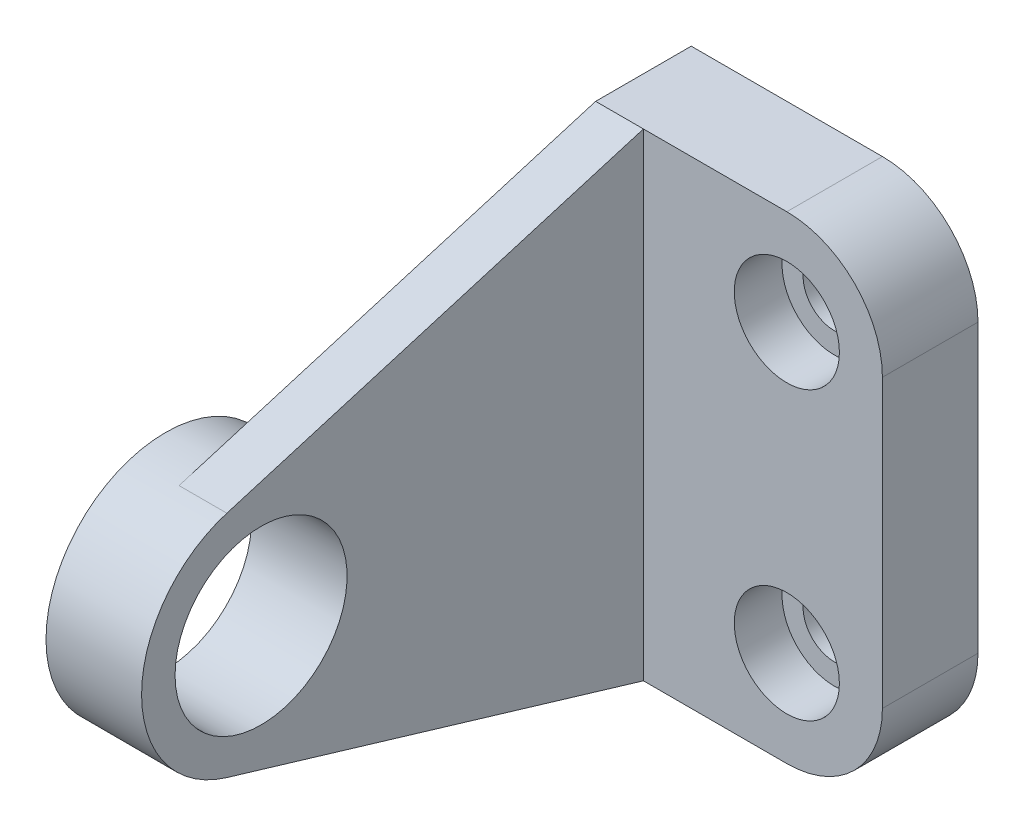
ISO-10303-21;
HEADER;
FILE_DESCRIPTION(('STEP AP214'),'2;1');
FILE_NAME('part.step','',(''),(''),'','','');
FILE_SCHEMA(('AUTOMOTIVE_DESIGN { 1 0 10303 214 1 1 1 1 }'));
ENDSEC;
DATA;
#1=APPLICATION_CONTEXT('core data for automotive mechanical design processes');
#2=APPLICATION_PROTOCOL_DEFINITION('international standard','automotive_design',2000,#1);
#3=PRODUCT_CONTEXT('',#1,'mechanical');
#4=PRODUCT('Part','Part','',(#3));
#5=PRODUCT_RELATED_PRODUCT_CATEGORY('part','',(#4));
#6=PRODUCT_DEFINITION_FORMATION('','',#4);
#7=PRODUCT_DEFINITION_CONTEXT('part definition',#1,'design');
#8=PRODUCT_DEFINITION('design','',#6,#7);
#9=PRODUCT_DEFINITION_SHAPE('','',#8);
#10=(LENGTH_UNIT() NAMED_UNIT(*) SI_UNIT(.MILLI.,.METRE.));
#11=(NAMED_UNIT(*) PLANE_ANGLE_UNIT() SI_UNIT($,.RADIAN.));
#12=(NAMED_UNIT(*) SI_UNIT($,.STERADIAN.) SOLID_ANGLE_UNIT());
#13=UNCERTAINTY_MEASURE_WITH_UNIT(LENGTH_MEASURE(1.E-05),#10,'distance_accuracy_value','');
#14=(GEOMETRIC_REPRESENTATION_CONTEXT(3) GLOBAL_UNCERTAINTY_ASSIGNED_CONTEXT((#13)) GLOBAL_UNIT_ASSIGNED_CONTEXT((#10,
#11,#12)) REPRESENTATION_CONTEXT('',''));
#15=CARTESIAN_POINT('',(0.,0.,0.));
#16=DIRECTION('',(0.,0.,1.));
#17=DIRECTION('',(1.,0.,0.));
#18=AXIS2_PLACEMENT_3D('',#15,#16,#17);
#19=CARTESIAN_POINT('',(15.,25.,10.));
#20=DIRECTION('',(-1.,0.,0.));
#21=DIRECTION('',(0.,0.,1.));
#22=AXIS2_PLACEMENT_3D('',#19,#20,#21);
#23=PLANE('',#22);
#24=DIRECTION('',(0.,1.,0.));
#25=VECTOR('',#24,1.);
#26=CARTESIAN_POINT('',(15.,25.,0.));
#27=LINE('',#26,#25);
#28=CARTESIAN_POINT('',(15.,-15.,0.));
#29=VERTEX_POINT('',#28);
#30=CARTESIAN_POINT('',(15.,15.,0.));
#31=VERTEX_POINT('',#30);
#32=EDGE_CURVE('E159',#29,#31,#27,.T.);
#33=ORIENTED_EDGE('',*,*,#32,.T.);
#34=DIRECTION('',(0.,0.,-1.));
#35=VECTOR('',#34,1.);
#36=CARTESIAN_POINT('',(15.,15.,10.));
#37=LINE('',#36,#35);
#38=CARTESIAN_POINT('',(15.,15.,10.));
#39=VERTEX_POINT('',#38);
#40=EDGE_CURVE('E63',#31,#39,#37,.F.);
#41=ORIENTED_EDGE('',*,*,#40,.T.);
#42=DIRECTION('',(0.,1.,0.));
#43=VECTOR('',#42,1.);
#44=CARTESIAN_POINT('',(15.,25.,10.));
#45=LINE('',#44,#43);
#46=CARTESIAN_POINT('',(15.,-15.,10.));
#47=VERTEX_POINT('',#46);
#48=EDGE_CURVE('E149',#47,#39,#45,.T.);
#49=ORIENTED_EDGE('',*,*,#48,.F.);
#50=DIRECTION('',(0.,0.,-1.));
#51=VECTOR('',#50,1.);
#52=CARTESIAN_POINT('',(15.,-15.,10.));
#53=LINE('',#52,#51);
#54=EDGE_CURVE('E178',#47,#29,#53,.T.);
#55=ORIENTED_EDGE('',*,*,#54,.T.);
#56=EDGE_LOOP('',(#33,#41,#49,#55));
#57=FACE_BOUND('',#56,.T.);
#58=ADVANCED_FACE('F42',(#57),#23,.F.);
#59=CARTESIAN_POINT('',(-15.,25.,10.));
#60=DIRECTION('',(0.,-1.,0.));
#61=DIRECTION('',(0.,0.,-1.));
#62=AXIS2_PLACEMENT_3D('',#59,#60,#61);
#63=PLANE('',#62);
#64=DIRECTION('',(-1.,0.,0.));
#65=VECTOR('',#64,1.);
#66=CARTESIAN_POINT('',(-15.,25.,10.));
#67=LINE('',#66,#65);
#68=CARTESIAN_POINT('',(5.,25.,10.));
#69=VERTEX_POINT('',#68);
#70=CARTESIAN_POINT('',(-10.,25.,10.));
#71=VERTEX_POINT('',#70);
#72=EDGE_CURVE('E151',#69,#71,#67,.T.);
#73=ORIENTED_EDGE('',*,*,#72,.F.);
#74=DIRECTION('',(0.,0.,-1.));
#75=VECTOR('',#74,1.);
#76=CARTESIAN_POINT('',(5.,25.,10.));
#77=LINE('',#76,#75);
#78=CARTESIAN_POINT('',(5.,25.,0.));
#79=VERTEX_POINT('',#78);
#80=EDGE_CURVE('E171',#69,#79,#77,.T.);
#81=ORIENTED_EDGE('',*,*,#80,.T.);
#82=DIRECTION('',(-1.,0.,0.));
#83=VECTOR('',#82,1.);
#84=CARTESIAN_POINT('',(-15.,25.,0.));
#85=LINE('',#84,#83);
#86=CARTESIAN_POINT('',(-15.,25.,0.));
#87=VERTEX_POINT('',#86);
#88=EDGE_CURVE('E161',#79,#87,#85,.T.);
#89=ORIENTED_EDGE('',*,*,#88,.T.);
#90=DIRECTION('',(0.,0.,-1.));
#91=VECTOR('',#90,1.);
#92=CARTESIAN_POINT('',(-15.,25.,10.));
#93=LINE('',#92,#91);
#94=CARTESIAN_POINT('',(-15.,25.,10.));
#95=VERTEX_POINT('',#94);
#96=EDGE_CURVE('E168',#95,#87,#93,.T.);
#97=ORIENTED_EDGE('',*,*,#96,.F.);
#98=DIRECTION('',(-1.,0.,0.));
#99=VECTOR('',#98,1.);
#100=CARTESIAN_POINT('',(-10.,25.,10.));
#101=LINE('',#100,#99);
#102=EDGE_CURVE('E142',#71,#95,#101,.T.);
#103=ORIENTED_EDGE('',*,*,#102,.F.);
#104=EDGE_LOOP('',(#73,#81,#89,#97,#103));
#105=FACE_BOUND('',#104,.T.);
#106=ADVANCED_FACE('F191',(#105),#63,.F.);
#107=CARTESIAN_POINT('',(-15.,25.,10.));
#108=DIRECTION('',(1.,0.,0.));
#109=DIRECTION('',(0.,0.,-1.));
#110=AXIS2_PLACEMENT_3D('',#107,#108,#109);
#111=PLANE('',#110);
#112=DIRECTION('',(0.,-1.,0.));
#113=VECTOR('',#112,1.);
#114=CARTESIAN_POINT('',(-15.,25.,0.));
#115=LINE('',#114,#113);
#116=CARTESIAN_POINT('',(-15.,-25.,0.));
#117=VERTEX_POINT('',#116);
#118=EDGE_CURVE('E163',#87,#117,#115,.T.);
#119=ORIENTED_EDGE('',*,*,#118,.T.);
#120=DIRECTION('',(0.,0.,-1.));
#121=VECTOR('',#120,1.);
#122=CARTESIAN_POINT('',(-15.,-25.,10.));
#123=LINE('',#122,#121);
#124=CARTESIAN_POINT('',(-15.,-25.,10.));
#125=VERTEX_POINT('',#124);
#126=EDGE_CURVE('E158',#125,#117,#123,.T.);
#127=ORIENTED_EDGE('',*,*,#126,.F.);
#128=DIRECTION('',(0.,0.286331612321917,0.958130579715068));
#129=VECTOR('',#128,1.);
#130=CARTESIAN_POINT('',(-15.,-25.6937859316758,7.6784347647674));
#131=LINE('',#130,#129);
#132=CARTESIAN_POINT('',(-15.,-11.9766322464384,53.579145154024));
#133=VERTEX_POINT('',#132);
#134=EDGE_CURVE('E136',#125,#133,#131,.T.);
#135=ORIENTED_EDGE('',*,*,#134,.T.);
#136=CARTESIAN_POINT('',(-15.,0.,50.));
#137=DIRECTION('',(-1.,0.,0.));
#138=DIRECTION('',(0.,0.,1.));
#139=AXIS2_PLACEMENT_3D('',#136,#137,#138);
#140=CIRCLE('',#139,12.5);
#141=CARTESIAN_POINT('',(-15.,11.9766322464383,53.579145154024));
#142=VERTEX_POINT('',#141);
#143=EDGE_CURVE('E125',#142,#133,#140,.T.);
#144=ORIENTED_EDGE('',*,*,#143,.F.);
#145=DIRECTION('',(0.,-0.286331612321917,0.958130579715068));
#146=VECTOR('',#145,1.);
#147=CARTESIAN_POINT('',(-15.,25.6937859316758,7.6784347647674));
#148=LINE('',#147,#146);
#149=EDGE_CURVE('E140',#95,#142,#148,.T.);
#150=ORIENTED_EDGE('',*,*,#149,.F.);
#151=ORIENTED_EDGE('',*,*,#96,.T.);
#152=EDGE_LOOP('',(#119,#127,#135,#144,#150,#151));
#153=FACE_BOUND('',#152,.T.);
#154=ADVANCED_FACE('F207',(#153),#111,.F.);
#155=CARTESIAN_POINT('',(-15.,-25.,10.));
#156=DIRECTION('',(0.,1.,0.));
#157=DIRECTION('',(0.,0.,1.));
#158=AXIS2_PLACEMENT_3D('',#155,#156,#157);
#159=PLANE('',#158);
#160=DIRECTION('',(1.,0.,0.));
#161=VECTOR('',#160,1.);
#162=CARTESIAN_POINT('',(-15.,-25.,0.));
#163=LINE('',#162,#161);
#164=CARTESIAN_POINT('',(5.,-25.,0.));
#165=VERTEX_POINT('',#164);
#166=EDGE_CURVE('E152',#117,#165,#163,.T.);
#167=ORIENTED_EDGE('',*,*,#166,.T.);
#168=DIRECTION('',(0.,0.,-1.));
#169=VECTOR('',#168,1.);
#170=CARTESIAN_POINT('',(5.,-25.,10.));
#171=LINE('',#170,#169);
#172=CARTESIAN_POINT('',(5.,-25.,10.));
#173=VERTEX_POINT('',#172);
#174=EDGE_CURVE('E11',#165,#173,#171,.F.);
#175=ORIENTED_EDGE('',*,*,#174,.T.);
#176=DIRECTION('',(1.,0.,0.));
#177=VECTOR('',#176,1.);
#178=CARTESIAN_POINT('',(-15.,-25.,10.));
#179=LINE('',#178,#177);
#180=CARTESIAN_POINT('',(-10.,-25.,10.));
#181=VERTEX_POINT('',#180);
#182=EDGE_CURVE('E154',#181,#173,#179,.T.);
#183=ORIENTED_EDGE('',*,*,#182,.F.);
#184=EDGE_CURVE('E155',#125,#181,#179,.T.);
#185=ORIENTED_EDGE('',*,*,#184,.F.);
#186=ORIENTED_EDGE('',*,*,#126,.T.);
#187=EDGE_LOOP('',(#167,#175,#183,#185,#186));
#188=FACE_BOUND('',#187,.T.);
#189=ADVANCED_FACE('F202',(#188),#159,.F.);
#190=CARTESIAN_POINT('',(0.,0.,10.));
#191=DIRECTION('',(0.,0.,1.));
#192=DIRECTION('',(1.,0.,0.));
#193=AXIS2_PLACEMENT_3D('',#190,#191,#192);
#194=PLANE('',#193);
#195=CARTESIAN_POINT('',(5.,-15.,10.));
#196=DIRECTION('',(0.,0.,1.));
#197=DIRECTION('',(1.,0.,0.));
#198=AXIS2_PLACEMENT_3D('',#195,#196,#197);
#199=CIRCLE('',#198,5.49999999999999);
#200=CARTESIAN_POINT('',(10.5,-15.,10.));
#201=VERTEX_POINT('',#200);
#202=EDGE_CURVE('E357',#201,#201,#199,.T.);
#203=ORIENTED_EDGE('',*,*,#202,.F.);
#204=EDGE_LOOP('',(#203));
#205=FACE_BOUND('',#204,.T.);
#206=CARTESIAN_POINT('',(5.,15.,10.));
#207=DIRECTION('',(0.,0.,1.));
#208=DIRECTION('',(1.,0.,0.));
#209=AXIS2_PLACEMENT_3D('',#206,#207,#208);
#210=CIRCLE('',#209,5.49999999999999);
#211=CARTESIAN_POINT('',(10.5,15.,10.));
#212=VERTEX_POINT('',#211);
#213=EDGE_CURVE('E367',#212,#212,#210,.T.);
#214=ORIENTED_EDGE('',*,*,#213,.F.);
#215=EDGE_LOOP('',(#214));
#216=FACE_BOUND('',#215,.T.);
#217=ORIENTED_EDGE('',*,*,#48,.T.);
#218=CARTESIAN_POINT('',(5.,15.,10.));
#219=DIRECTION('',(0.,0.,1.));
#220=DIRECTION('',(1.,0.,0.));
#221=AXIS2_PLACEMENT_3D('',#218,#219,#220);
#222=CIRCLE('',#221,10.);
#223=EDGE_CURVE('E50',#39,#69,#222,.T.);
#224=ORIENTED_EDGE('',*,*,#223,.T.);
#225=ORIENTED_EDGE('',*,*,#72,.T.);
#226=DIRECTION('',(0.,1.,0.));
#227=VECTOR('',#226,1.);
#228=CARTESIAN_POINT('',(-10.,0.,10.));
#229=LINE('',#228,#227);
#230=EDGE_CURVE('E133',#181,#71,#229,.T.);
#231=ORIENTED_EDGE('',*,*,#230,.F.);
#232=ORIENTED_EDGE('',*,*,#182,.T.);
#233=CARTESIAN_POINT('',(5.,-15.,10.));
#234=DIRECTION('',(0.,0.,1.));
#235=DIRECTION('',(1.,0.,0.));
#236=AXIS2_PLACEMENT_3D('',#233,#234,#235);
#237=CIRCLE('',#236,10.);
#238=EDGE_CURVE('E182',#173,#47,#237,.T.);
#239=ORIENTED_EDGE('',*,*,#238,.T.);
#240=EDGE_LOOP('',(#217,#224,#225,#231,#232,#239));
#241=FACE_BOUND('',#240,.T.);
#242=ADVANCED_FACE('F186',(#205,#216,#241),#194,.T.);
#243=CARTESIAN_POINT('',(0.,0.,0.));
#244=DIRECTION('',(0.,0.,1.));
#245=DIRECTION('',(1.,0.,0.));
#246=AXIS2_PLACEMENT_3D('',#243,#244,#245);
#247=PLANE('',#246);
#248=CARTESIAN_POINT('',(5.,-15.,0.));
#249=DIRECTION('',(0.,0.,1.));
#250=DIRECTION('',(1.,0.,0.));
#251=AXIS2_PLACEMENT_3D('',#248,#249,#250);
#252=CIRCLE('',#251,3.3);
#253=CARTESIAN_POINT('',(8.3,-15.,0.));
#254=VERTEX_POINT('',#253);
#255=EDGE_CURVE('E364',#254,#254,#252,.T.);
#256=ORIENTED_EDGE('',*,*,#255,.T.);
#257=EDGE_LOOP('',(#256));
#258=FACE_BOUND('',#257,.T.);
#259=CARTESIAN_POINT('',(5.,15.,0.));
#260=DIRECTION('',(0.,0.,1.));
#261=DIRECTION('',(1.,0.,0.));
#262=AXIS2_PLACEMENT_3D('',#259,#260,#261);
#263=CIRCLE('',#262,3.3);
#264=CARTESIAN_POINT('',(8.3,15.,0.));
#265=VERTEX_POINT('',#264);
#266=EDGE_CURVE('E376',#265,#265,#263,.T.);
#267=ORIENTED_EDGE('',*,*,#266,.T.);
#268=EDGE_LOOP('',(#267));
#269=FACE_BOUND('',#268,.T.);
#270=ORIENTED_EDGE('',*,*,#88,.F.);
#271=CARTESIAN_POINT('',(5.,15.,0.));
#272=DIRECTION('',(0.,0.,1.));
#273=DIRECTION('',(1.,0.,0.));
#274=AXIS2_PLACEMENT_3D('',#271,#272,#273);
#275=CIRCLE('',#274,10.);
#276=EDGE_CURVE('E176',#79,#31,#275,.F.);
#277=ORIENTED_EDGE('',*,*,#276,.T.);
#278=ORIENTED_EDGE('',*,*,#32,.F.);
#279=CARTESIAN_POINT('',(5.,-15.,0.));
#280=DIRECTION('',(0.,0.,1.));
#281=DIRECTION('',(1.,0.,0.));
#282=AXIS2_PLACEMENT_3D('',#279,#280,#281);
#283=CIRCLE('',#282,10.);
#284=EDGE_CURVE('E174',#29,#165,#283,.F.);
#285=ORIENTED_EDGE('',*,*,#284,.T.);
#286=ORIENTED_EDGE('',*,*,#166,.F.);
#287=ORIENTED_EDGE('',*,*,#118,.F.);
#288=EDGE_LOOP('',(#270,#277,#278,#285,#286,#287));
#289=FACE_BOUND('',#288,.T.);
#290=ADVANCED_FACE('F196',(#258,#269,#289),#247,.F.);
#291=CARTESIAN_POINT('',(-10.,-25.6937859316758,7.6784347647674));
#292=DIRECTION('',(0.,-0.958130579715068,0.286331612321917));
#293=DIRECTION('',(0.,-0.286331612321917,-0.958130579715068));
#294=AXIS2_PLACEMENT_3D('',#291,#292,#293);
#295=PLANE('',#294);
#296=ORIENTED_EDGE('',*,*,#134,.F.);
#297=ORIENTED_EDGE('',*,*,#184,.T.);
#298=DIRECTION('',(0.,0.286331612321917,0.958130579715068));
#299=VECTOR('',#298,1.);
#300=CARTESIAN_POINT('',(-10.,-25.6937859316758,7.6784347647674));
#301=LINE('',#300,#299);
#302=CARTESIAN_POINT('',(-10.,-11.9766322464383,53.579145154024));
#303=VERTEX_POINT('',#302);
#304=EDGE_CURVE('E143',#181,#303,#301,.T.);
#305=ORIENTED_EDGE('',*,*,#304,.T.);
#306=DIRECTION('',(-1.,0.,0.));
#307=VECTOR('',#306,1.);
#308=CARTESIAN_POINT('',(-10.,-11.9766322464383,53.579145154024));
#309=LINE('',#308,#307);
#310=EDGE_CURVE('E121',#303,#133,#309,.T.);
#311=ORIENTED_EDGE('',*,*,#310,.T.);
#312=EDGE_LOOP('',(#296,#297,#305,#311));
#313=FACE_BOUND('',#312,.T.);
#314=ADVANCED_FACE('F212',(#313),#295,.T.);
#315=CARTESIAN_POINT('',(-10.,25.6937859316758,7.6784347647674));
#316=DIRECTION('',(0.,-0.958130579715068,-0.286331612321917));
#317=DIRECTION('',(0.,0.286331612321917,-0.958130579715068));
#318=AXIS2_PLACEMENT_3D('',#315,#316,#317);
#319=PLANE('',#318);
#320=ORIENTED_EDGE('',*,*,#149,.T.);
#321=DIRECTION('',(-1.,0.,0.));
#322=VECTOR('',#321,1.);
#323=CARTESIAN_POINT('',(-10.,11.9766322464383,53.579145154024));
#324=LINE('',#323,#322);
#325=CARTESIAN_POINT('',(-10.,11.9766322464383,53.579145154024));
#326=VERTEX_POINT('',#325);
#327=EDGE_CURVE('E118',#326,#142,#324,.T.);
#328=ORIENTED_EDGE('',*,*,#327,.F.);
#329=DIRECTION('',(0.,-0.286331612321917,0.958130579715068));
#330=VECTOR('',#329,1.);
#331=CARTESIAN_POINT('',(-10.,25.6937859316758,7.6784347647674));
#332=LINE('',#331,#330);
#333=EDGE_CURVE('E130',#71,#326,#332,.T.);
#334=ORIENTED_EDGE('',*,*,#333,.F.);
#335=ORIENTED_EDGE('',*,*,#102,.T.);
#336=EDGE_LOOP('',(#320,#328,#334,#335));
#337=FACE_BOUND('',#336,.T.);
#338=ADVANCED_FACE('F138',(#337),#319,.F.);
#339=CARTESIAN_POINT('',(-10.,0.,0.));
#340=DIRECTION('',(-1.,0.,0.));
#341=DIRECTION('',(0.,0.,1.));
#342=AXIS2_PLACEMENT_3D('',#339,#340,#341);
#343=PLANE('',#342);
#344=ORIENTED_EDGE('',*,*,#333,.T.);
#345=CARTESIAN_POINT('',(-10.,0.,50.));
#346=DIRECTION('',(-1.,0.,0.));
#347=DIRECTION('',(0.,0.,1.));
#348=AXIS2_PLACEMENT_3D('',#345,#346,#347);
#349=CIRCLE('',#348,12.5);
#350=EDGE_CURVE('E114',#303,#326,#349,.T.);
#351=ORIENTED_EDGE('',*,*,#350,.F.);
#352=ORIENTED_EDGE('',*,*,#304,.F.);
#353=ORIENTED_EDGE('',*,*,#230,.T.);
#354=EDGE_LOOP('',(#344,#351,#352,#353));
#355=FACE_BOUND('',#354,.T.);
#356=CARTESIAN_POINT('',(-10.,0.,50.));
#357=DIRECTION('',(-1.,0.,0.));
#358=DIRECTION('',(0.,0.,1.));
#359=AXIS2_PLACEMENT_3D('',#356,#357,#358);
#360=CIRCLE('',#359,9.);
#361=CARTESIAN_POINT('',(-10.,0.,59.));
#362=VERTEX_POINT('',#361);
#363=EDGE_CURVE('E126',#362,#362,#360,.T.);
#364=ORIENTED_EDGE('',*,*,#363,.T.);
#365=EDGE_LOOP('',(#364));
#366=FACE_BOUND('',#365,.T.);
#367=ADVANCED_FACE('F131',(#355,#366),#343,.F.);
#368=CARTESIAN_POINT('',(-10.,0.,50.));
#369=DIRECTION('',(-1.,0.,0.));
#370=DIRECTION('',(0.,0.,1.));
#371=AXIS2_PLACEMENT_3D('',#368,#369,#370);
#372=CYLINDRICAL_SURFACE('',#371,12.5);
#373=CARTESIAN_POINT('',(-20.,0.,50.));
#374=DIRECTION('',(-1.,0.,0.));
#375=DIRECTION('',(0.,0.,1.));
#376=AXIS2_PLACEMENT_3D('',#373,#374,#375);
#377=CIRCLE('',#376,12.5);
#378=CARTESIAN_POINT('',(-20.,0.,62.5));
#379=VERTEX_POINT('',#378);
#380=EDGE_CURVE('E382',#379,#379,#377,.T.);
#381=ORIENTED_EDGE('',*,*,#380,.F.);
#382=EDGE_LOOP('',(#381));
#383=FACE_BOUND('',#382,.T.);
#384=ORIENTED_EDGE('',*,*,#310,.F.);
#385=ORIENTED_EDGE('',*,*,#350,.T.);
#386=ORIENTED_EDGE('',*,*,#327,.T.);
#387=ORIENTED_EDGE('',*,*,#143,.T.);
#388=EDGE_LOOP('',(#384,#385,#386,#387));
#389=FACE_BOUND('',#388,.T.);
#390=ADVANCED_FACE('F116',(#383,#389),#372,.T.);
#391=CARTESIAN_POINT('',(-10.,0.,50.));
#392=DIRECTION('',(-1.,0.,0.));
#393=DIRECTION('',(0.,0.,1.));
#394=AXIS2_PLACEMENT_3D('',#391,#392,#393);
#395=CYLINDRICAL_SURFACE('',#394,9.);
#396=ORIENTED_EDGE('',*,*,#363,.F.);
#397=EDGE_LOOP('',(#396));
#398=FACE_BOUND('',#397,.T.);
#399=CARTESIAN_POINT('',(-20.,0.,50.));
#400=DIRECTION('',(-1.,0.,0.));
#401=DIRECTION('',(0.,0.,1.));
#402=AXIS2_PLACEMENT_3D('',#399,#400,#401);
#403=CIRCLE('',#402,9.);
#404=CARTESIAN_POINT('',(-20.,0.,59.));
#405=VERTEX_POINT('',#404);
#406=EDGE_CURVE('E379',#405,#405,#403,.T.);
#407=ORIENTED_EDGE('',*,*,#406,.T.);
#408=EDGE_LOOP('',(#407));
#409=FACE_BOUND('',#408,.T.);
#410=ADVANCED_FACE('F237',(#398,#409),#395,.F.);
#411=CARTESIAN_POINT('',(-20.,0.,0.));
#412=DIRECTION('',(-1.,0.,0.));
#413=DIRECTION('',(0.,0.,1.));
#414=AXIS2_PLACEMENT_3D('',#411,#412,#413);
#415=PLANE('',#414);
#416=ORIENTED_EDGE('',*,*,#406,.F.);
#417=EDGE_LOOP('',(#416));
#418=FACE_BOUND('',#417,.T.);
#419=ORIENTED_EDGE('',*,*,#380,.T.);
#420=EDGE_LOOP('',(#419));
#421=FACE_BOUND('',#420,.T.);
#422=ADVANCED_FACE('F231',(#418,#421),#415,.T.);
#423=CARTESIAN_POINT('',(5.,15.,10.));
#424=DIRECTION('',(0.,0.,-1.));
#425=DIRECTION('',(-1.,0.,0.));
#426=AXIS2_PLACEMENT_3D('',#423,#424,#425);
#427=CYLINDRICAL_SURFACE('',#426,10.);
#428=ORIENTED_EDGE('',*,*,#223,.F.);
#429=ORIENTED_EDGE('',*,*,#40,.F.);
#430=ORIENTED_EDGE('',*,*,#276,.F.);
#431=ORIENTED_EDGE('',*,*,#80,.F.);
#432=EDGE_LOOP('',(#428,#429,#430,#431));
#433=FACE_BOUND('',#432,.T.);
#434=ADVANCED_FACE('F193',(#433),#427,.T.);
#435=CARTESIAN_POINT('',(5.,-15.,10.));
#436=DIRECTION('',(0.,0.,-1.));
#437=DIRECTION('',(-1.,0.,0.));
#438=AXIS2_PLACEMENT_3D('',#435,#436,#437);
#439=CYLINDRICAL_SURFACE('',#438,10.);
#440=ORIENTED_EDGE('',*,*,#238,.F.);
#441=ORIENTED_EDGE('',*,*,#174,.F.);
#442=ORIENTED_EDGE('',*,*,#284,.F.);
#443=ORIENTED_EDGE('',*,*,#54,.F.);
#444=EDGE_LOOP('',(#440,#441,#442,#443));
#445=FACE_BOUND('',#444,.T.);
#446=ADVANCED_FACE('F44',(#445),#439,.T.);
#447=CARTESIAN_POINT('',(5.,15.,10.));
#448=DIRECTION('',(0.,0.,1.));
#449=DIRECTION('',(1.,0.,0.));
#450=AXIS2_PLACEMENT_3D('',#447,#448,#449);
#451=CYLINDRICAL_SURFACE('',#450,3.3);
#452=ORIENTED_EDGE('',*,*,#266,.F.);
#453=EDGE_LOOP('',(#452));
#454=FACE_BOUND('',#453,.T.);
#455=CARTESIAN_POINT('',(5.,15.,5.));
#456=DIRECTION('',(0.,0.,1.));
#457=DIRECTION('',(1.,0.,0.));
#458=AXIS2_PLACEMENT_3D('',#455,#456,#457);
#459=CIRCLE('',#458,3.3);
#460=CARTESIAN_POINT('',(8.3,15.,5.));
#461=VERTEX_POINT('',#460);
#462=EDGE_CURVE('E373',#461,#461,#459,.T.);
#463=ORIENTED_EDGE('',*,*,#462,.T.);
#464=EDGE_LOOP('',(#463));
#465=FACE_BOUND('',#464,.T.);
#466=ADVANCED_FACE('F236',(#454,#465),#451,.F.);
#467=CARTESIAN_POINT('',(8.3,15.,5.));
#468=DIRECTION('',(0.,0.,-1.));
#469=DIRECTION('',(-1.,0.,0.));
#470=AXIS2_PLACEMENT_3D('',#467,#468,#469);
#471=PLANE('',#470);
#472=ORIENTED_EDGE('',*,*,#462,.F.);
#473=EDGE_LOOP('',(#472));
#474=FACE_BOUND('',#473,.T.);
#475=CARTESIAN_POINT('',(5.,15.,5.));
#476=DIRECTION('',(0.,0.,1.));
#477=DIRECTION('',(1.,0.,0.));
#478=AXIS2_PLACEMENT_3D('',#475,#476,#477);
#479=CIRCLE('',#478,5.5);
#480=CARTESIAN_POINT('',(10.5,15.,5.));
#481=VERTEX_POINT('',#480);
#482=EDGE_CURVE('E370',#481,#481,#479,.T.);
#483=ORIENTED_EDGE('',*,*,#482,.T.);
#484=EDGE_LOOP('',(#483));
#485=FACE_BOUND('',#484,.T.);
#486=ADVANCED_FACE('F298',(#474,#485),#471,.F.);
#487=CARTESIAN_POINT('',(5.,15.,10.));
#488=DIRECTION('',(0.,0.,1.));
#489=DIRECTION('',(1.,0.,0.));
#490=AXIS2_PLACEMENT_3D('',#487,#488,#489);
#491=CYLINDRICAL_SURFACE('',#490,5.5);
#492=ORIENTED_EDGE('',*,*,#482,.F.);
#493=EDGE_LOOP('',(#492));
#494=FACE_BOUND('',#493,.T.);
#495=ORIENTED_EDGE('',*,*,#213,.T.);
#496=EDGE_LOOP('',(#495));
#497=FACE_BOUND('',#496,.T.);
#498=ADVANCED_FACE('F308',(#494,#497),#491,.F.);
#499=CARTESIAN_POINT('',(5.,-15.,10.));
#500=DIRECTION('',(0.,0.,1.));
#501=DIRECTION('',(1.,0.,0.));
#502=AXIS2_PLACEMENT_3D('',#499,#500,#501);
#503=CYLINDRICAL_SURFACE('',#502,3.3);
#504=ORIENTED_EDGE('',*,*,#255,.F.);
#505=EDGE_LOOP('',(#504));
#506=FACE_BOUND('',#505,.T.);
#507=CARTESIAN_POINT('',(5.,-15.,5.));
#508=DIRECTION('',(0.,0.,1.));
#509=DIRECTION('',(1.,0.,0.));
#510=AXIS2_PLACEMENT_3D('',#507,#508,#509);
#511=CIRCLE('',#510,3.3);
#512=CARTESIAN_POINT('',(8.3,-15.,5.));
#513=VERTEX_POINT('',#512);
#514=EDGE_CURVE('E359',#513,#513,#511,.T.);
#515=ORIENTED_EDGE('',*,*,#514,.T.);
#516=EDGE_LOOP('',(#515));
#517=FACE_BOUND('',#516,.T.);
#518=ADVANCED_FACE('F317',(#506,#517),#503,.F.);
#519=CARTESIAN_POINT('',(8.3,-15.,5.));
#520=DIRECTION('',(0.,0.,-1.));
#521=DIRECTION('',(-1.,0.,0.));
#522=AXIS2_PLACEMENT_3D('',#519,#520,#521);
#523=PLANE('',#522);
#524=ORIENTED_EDGE('',*,*,#514,.F.);
#525=EDGE_LOOP('',(#524));
#526=FACE_BOUND('',#525,.T.);
#527=CARTESIAN_POINT('',(5.,-15.,5.));
#528=DIRECTION('',(0.,0.,1.));
#529=DIRECTION('',(1.,0.,0.));
#530=AXIS2_PLACEMENT_3D('',#527,#528,#529);
#531=CIRCLE('',#530,5.5);
#532=CARTESIAN_POINT('',(10.5,-15.,5.));
#533=VERTEX_POINT('',#532);
#534=EDGE_CURVE('E354',#533,#533,#531,.T.);
#535=ORIENTED_EDGE('',*,*,#534,.T.);
#536=EDGE_LOOP('',(#535));
#537=FACE_BOUND('',#536,.T.);
#538=ADVANCED_FACE('F327',(#526,#537),#523,.F.);
#539=CARTESIAN_POINT('',(5.,-15.,10.));
#540=DIRECTION('',(0.,0.,1.));
#541=DIRECTION('',(1.,0.,0.));
#542=AXIS2_PLACEMENT_3D('',#539,#540,#541);
#543=CYLINDRICAL_SURFACE('',#542,5.5);
#544=ORIENTED_EDGE('',*,*,#534,.F.);
#545=EDGE_LOOP('',(#544));
#546=FACE_BOUND('',#545,.T.);
#547=ORIENTED_EDGE('',*,*,#202,.T.);
#548=EDGE_LOOP('',(#547));
#549=FACE_BOUND('',#548,.T.);
#550=ADVANCED_FACE('F337',(#546,#549),#543,.F.);
#551=CLOSED_SHELL('',(#58,#106,#154,#189,#242,#290,#314,#338,#367,#390,#410,#422,#434,#446,#466,
#486,#498,#518,#538,#550));
#552=MANIFOLD_SOLID_BREP('B2',#551);
#553=ADVANCED_BREP_SHAPE_REPRESENTATION('',(#18,#552),#14);
#554=SHAPE_DEFINITION_REPRESENTATION(#9,#553);
ENDSEC;
END-ISO-10303-21;
